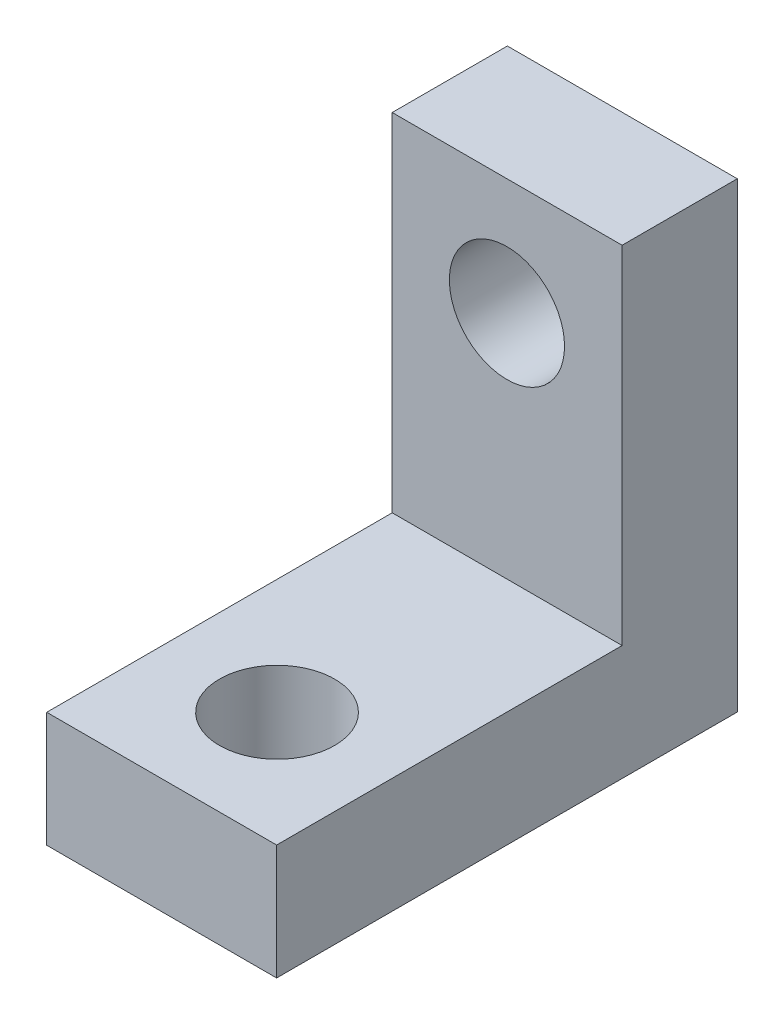
ISO-10303-21;
HEADER;
FILE_DESCRIPTION(('STEP AP214'),'2;1');
FILE_NAME('part.step','',(''),(''),'','','');
FILE_SCHEMA(('AUTOMOTIVE_DESIGN { 1 0 10303 214 1 1 1 1 }'));
ENDSEC;
DATA;
#1=APPLICATION_CONTEXT('core data for automotive mechanical design processes');
#2=APPLICATION_PROTOCOL_DEFINITION('international standard','automotive_design',2000,#1);
#3=PRODUCT_CONTEXT('',#1,'mechanical');
#4=PRODUCT('Part','Part','',(#3));
#5=PRODUCT_RELATED_PRODUCT_CATEGORY('part','',(#4));
#6=PRODUCT_DEFINITION_FORMATION('','',#4);
#7=PRODUCT_DEFINITION_CONTEXT('part definition',#1,'design');
#8=PRODUCT_DEFINITION('design','',#6,#7);
#9=PRODUCT_DEFINITION_SHAPE('','',#8);
#10=(LENGTH_UNIT() NAMED_UNIT(*) SI_UNIT(.MILLI.,.METRE.));
#11=(NAMED_UNIT(*) PLANE_ANGLE_UNIT() SI_UNIT($,.RADIAN.));
#12=(NAMED_UNIT(*) SI_UNIT($,.STERADIAN.) SOLID_ANGLE_UNIT());
#13=UNCERTAINTY_MEASURE_WITH_UNIT(LENGTH_MEASURE(1.E-05),#10,'distance_accuracy_value','');
#14=(GEOMETRIC_REPRESENTATION_CONTEXT(3) GLOBAL_UNCERTAINTY_ASSIGNED_CONTEXT((#13)) GLOBAL_UNIT_ASSIGNED_CONTEXT((#10,
#11,#12)) REPRESENTATION_CONTEXT('',''));
#15=CARTESIAN_POINT('',(0.,0.,0.));
#16=DIRECTION('',(0.,0.,1.));
#17=DIRECTION('',(1.,0.,0.));
#18=AXIS2_PLACEMENT_3D('',#15,#16,#17);
#19=CARTESIAN_POINT('',(0.,0.,6.35));
#20=DIRECTION('',(0.,0.,-1.));
#21=DIRECTION('',(-1.,0.,0.));
#22=AXIS2_PLACEMENT_3D('',#19,#20,#21);
#23=PLANE('',#22);
#24=CARTESIAN_POINT('',(0.,0.,6.35));
#25=DIRECTION('',(0.,0.,1.));
#26=DIRECTION('',(1.,0.,0.));
#27=AXIS2_PLACEMENT_3D('',#24,#25,#26);
#28=CIRCLE('',#27,3.175);
#29=CARTESIAN_POINT('',(3.175,0.,6.35));
#30=VERTEX_POINT('',#29);
#31=EDGE_CURVE('E91',#30,#30,#28,.T.);
#32=ORIENTED_EDGE('',*,*,#31,.F.);
#33=EDGE_LOOP('',(#32));
#34=FACE_BOUND('',#33,.T.);
#35=DIRECTION('',(-1.,0.,0.));
#36=VECTOR('',#35,1.);
#37=CARTESIAN_POINT('',(-6.32686783314895,-12.7,6.35));
#38=LINE('',#37,#36);
#39=CARTESIAN_POINT('',(6.35,-12.7,6.35));
#40=VERTEX_POINT('',#39);
#41=CARTESIAN_POINT('',(-6.32686783314895,-12.7,6.35));
#42=VERTEX_POINT('',#41);
#43=EDGE_CURVE('E55',#40,#42,#38,.T.);
#44=ORIENTED_EDGE('',*,*,#43,.F.);
#45=DIRECTION('',(0.,1.,0.));
#46=VECTOR('',#45,1.);
#47=CARTESIAN_POINT('',(6.35,-19.05,6.35));
#48=LINE('',#47,#46);
#49=CARTESIAN_POINT('',(6.35,6.41557466178,6.35));
#50=VERTEX_POINT('',#49);
#51=EDGE_CURVE('E110',#40,#50,#48,.T.);
#52=ORIENTED_EDGE('',*,*,#51,.T.);
#53=DIRECTION('',(-1.,0.,0.));
#54=VECTOR('',#53,1.);
#55=CARTESIAN_POINT('',(-6.32686783314895,6.41557466178,6.35));
#56=LINE('',#55,#54);
#57=CARTESIAN_POINT('',(-6.32686783314895,6.41557466178,6.35));
#58=VERTEX_POINT('',#57);
#59=EDGE_CURVE('E61',#50,#58,#56,.T.);
#60=ORIENTED_EDGE('',*,*,#59,.T.);
#61=DIRECTION('',(0.,-1.,0.));
#62=VECTOR('',#61,1.);
#63=CARTESIAN_POINT('',(-6.32686783314895,0.,6.35));
#64=LINE('',#63,#62);
#65=EDGE_CURVE('E101',#58,#42,#64,.T.);
#66=ORIENTED_EDGE('',*,*,#65,.T.);
#67=EDGE_LOOP('',(#44,#52,#60,#66));
#68=FACE_BOUND('',#67,.T.);
#69=ADVANCED_FACE('F39',(#34,#68),#23,.F.);
#70=CARTESIAN_POINT('',(0.,0.,0.));
#71=DIRECTION('',(0.,0.,-1.));
#72=DIRECTION('',(-1.,0.,0.));
#73=AXIS2_PLACEMENT_3D('',#70,#71,#72);
#74=PLANE('',#73);
#75=DIRECTION('',(0.,-1.,0.));
#76=VECTOR('',#75,1.);
#77=CARTESIAN_POINT('',(-6.32686783314895,0.,0.));
#78=LINE('',#77,#76);
#79=CARTESIAN_POINT('',(-6.32686783314895,6.41557466178,0.));
#80=VERTEX_POINT('',#79);
#81=CARTESIAN_POINT('',(-6.32686783314895,-19.05,0.));
#82=VERTEX_POINT('',#81);
#83=EDGE_CURVE('E80',#80,#82,#78,.T.);
#84=ORIENTED_EDGE('',*,*,#83,.F.);
#85=DIRECTION('',(-1.,0.,0.));
#86=VECTOR('',#85,1.);
#87=CARTESIAN_POINT('',(-6.32686783314895,6.41557466178,0.));
#88=LINE('',#87,#86);
#89=CARTESIAN_POINT('',(6.35,6.41557466178,0.));
#90=VERTEX_POINT('',#89);
#91=EDGE_CURVE('E84',#90,#80,#88,.T.);
#92=ORIENTED_EDGE('',*,*,#91,.F.);
#93=DIRECTION('',(0.,1.,0.));
#94=VECTOR('',#93,1.);
#95=CARTESIAN_POINT('',(6.35,6.41557466178,0.));
#96=LINE('',#95,#94);
#97=CARTESIAN_POINT('',(6.35,-19.05,0.));
#98=VERTEX_POINT('',#97);
#99=EDGE_CURVE('E102',#98,#90,#96,.T.);
#100=ORIENTED_EDGE('',*,*,#99,.F.);
#101=DIRECTION('',(1.,0.,0.));
#102=VECTOR('',#101,1.);
#103=CARTESIAN_POINT('',(-6.32686783314895,-19.05,0.));
#104=LINE('',#103,#102);
#105=EDGE_CURVE('E86',#82,#98,#104,.T.);
#106=ORIENTED_EDGE('',*,*,#105,.F.);
#107=EDGE_LOOP('',(#84,#92,#100,#106));
#108=FACE_BOUND('',#107,.T.);
#109=CARTESIAN_POINT('',(0.,0.,0.));
#110=DIRECTION('',(0.,0.,1.));
#111=DIRECTION('',(1.,0.,0.));
#112=AXIS2_PLACEMENT_3D('',#109,#110,#111);
#113=CIRCLE('',#112,3.175);
#114=CARTESIAN_POINT('',(3.175,0.,0.));
#115=VERTEX_POINT('',#114);
#116=EDGE_CURVE('E158',#115,#115,#113,.T.);
#117=ORIENTED_EDGE('',*,*,#116,.T.);
#118=EDGE_LOOP('',(#117));
#119=FACE_BOUND('',#118,.T.);
#120=ADVANCED_FACE('F82',(#108,#119),#74,.T.);
#121=CARTESIAN_POINT('',(-6.32686783314895,0.,6.35));
#122=DIRECTION('',(1.,0.,0.));
#123=DIRECTION('',(0.,1.,0.));
#124=AXIS2_PLACEMENT_3D('',#121,#122,#123);
#125=PLANE('',#124);
#126=ORIENTED_EDGE('',*,*,#83,.T.);
#127=DIRECTION('',(0.,0.,-1.));
#128=VECTOR('',#127,1.);
#129=CARTESIAN_POINT('',(-6.32686783314895,-19.05,6.35));
#130=LINE('',#129,#128);
#131=CARTESIAN_POINT('',(-6.32686783314895,-19.05,25.4));
#132=VERTEX_POINT('',#131);
#133=EDGE_CURVE('E11',#132,#82,#130,.T.);
#134=ORIENTED_EDGE('',*,*,#133,.F.);
#135=DIRECTION('',(0.,-1.,0.));
#136=VECTOR('',#135,1.);
#137=CARTESIAN_POINT('',(-6.32686783314895,-19.05,25.4));
#138=LINE('',#137,#136);
#139=CARTESIAN_POINT('',(-6.32686783314895,-12.7,25.4));
#140=VERTEX_POINT('',#139);
#141=EDGE_CURVE('E136',#140,#132,#138,.T.);
#142=ORIENTED_EDGE('',*,*,#141,.F.);
#143=DIRECTION('',(0.,0.,-1.));
#144=VECTOR('',#143,1.);
#145=CARTESIAN_POINT('',(-6.32686783314895,-12.7,25.4));
#146=LINE('',#145,#144);
#147=EDGE_CURVE('E148',#140,#42,#146,.T.);
#148=ORIENTED_EDGE('',*,*,#147,.T.);
#149=ORIENTED_EDGE('',*,*,#65,.F.);
#150=DIRECTION('',(0.,0.,-1.));
#151=VECTOR('',#150,1.);
#152=CARTESIAN_POINT('',(-6.32686783314895,6.41557466178,6.35));
#153=LINE('',#152,#151);
#154=EDGE_CURVE('E96',#58,#80,#153,.T.);
#155=ORIENTED_EDGE('',*,*,#154,.T.);
#156=EDGE_LOOP('',(#126,#134,#142,#148,#149,#155));
#157=FACE_BOUND('',#156,.T.);
#158=ADVANCED_FACE('F41',(#157),#125,.F.);
#159=CARTESIAN_POINT('',(-6.32686783314895,-19.05,6.35));
#160=DIRECTION('',(0.,1.,0.));
#161=DIRECTION('',(0.,0.,1.));
#162=AXIS2_PLACEMENT_3D('',#159,#160,#161);
#163=PLANE('',#162);
#164=CARTESIAN_POINT('',(0.0231321668510498,-19.05,19.05));
#165=DIRECTION('',(0.,1.,0.));
#166=DIRECTION('',(0.,0.,1.));
#167=AXIS2_PLACEMENT_3D('',#164,#165,#166);
#168=CIRCLE('',#167,3.175);
#169=CARTESIAN_POINT('',(0.0231321668510498,-19.05,22.225));
#170=VERTEX_POINT('',#169);
#171=EDGE_CURVE('E151',#170,#170,#168,.T.);
#172=ORIENTED_EDGE('',*,*,#171,.T.);
#173=EDGE_LOOP('',(#172));
#174=FACE_BOUND('',#173,.T.);
#175=ORIENTED_EDGE('',*,*,#105,.T.);
#176=DIRECTION('',(0.,0.,-1.));
#177=VECTOR('',#176,1.);
#178=CARTESIAN_POINT('',(6.35,-19.05,6.35));
#179=LINE('',#178,#177);
#180=CARTESIAN_POINT('',(6.35,-19.05,25.4));
#181=VERTEX_POINT('',#180);
#182=EDGE_CURVE('E48',#181,#98,#179,.T.);
#183=ORIENTED_EDGE('',*,*,#182,.F.);
#184=DIRECTION('',(1.,0.,0.));
#185=VECTOR('',#184,1.);
#186=CARTESIAN_POINT('',(-6.32686783314895,-19.05,25.4));
#187=LINE('',#186,#185);
#188=EDGE_CURVE('E128',#132,#181,#187,.T.);
#189=ORIENTED_EDGE('',*,*,#188,.F.);
#190=ORIENTED_EDGE('',*,*,#133,.T.);
#191=EDGE_LOOP('',(#175,#183,#189,#190));
#192=FACE_BOUND('',#191,.T.);
#193=ADVANCED_FACE('F126',(#174,#192),#163,.F.);
#194=CARTESIAN_POINT('',(6.35,6.41557466178,6.35));
#195=DIRECTION('',(-1.,0.,0.));
#196=DIRECTION('',(0.,0.,1.));
#197=AXIS2_PLACEMENT_3D('',#194,#195,#196);
#198=PLANE('',#197);
#199=ORIENTED_EDGE('',*,*,#99,.T.);
#200=DIRECTION('',(0.,0.,-1.));
#201=VECTOR('',#200,1.);
#202=CARTESIAN_POINT('',(6.35,6.41557466178,6.35));
#203=LINE('',#202,#201);
#204=EDGE_CURVE('E99',#50,#90,#203,.T.);
#205=ORIENTED_EDGE('',*,*,#204,.F.);
#206=ORIENTED_EDGE('',*,*,#51,.F.);
#207=DIRECTION('',(0.,0.,-1.));
#208=VECTOR('',#207,1.);
#209=CARTESIAN_POINT('',(6.35,-12.7,25.4));
#210=LINE('',#209,#208);
#211=CARTESIAN_POINT('',(6.35,-12.7,25.4));
#212=VERTEX_POINT('',#211);
#213=EDGE_CURVE('E154',#212,#40,#210,.T.);
#214=ORIENTED_EDGE('',*,*,#213,.F.);
#215=DIRECTION('',(0.,1.,0.));
#216=VECTOR('',#215,1.);
#217=CARTESIAN_POINT('',(6.35,-19.05,25.4));
#218=LINE('',#217,#216);
#219=EDGE_CURVE('E122',#181,#212,#218,.T.);
#220=ORIENTED_EDGE('',*,*,#219,.F.);
#221=ORIENTED_EDGE('',*,*,#182,.T.);
#222=EDGE_LOOP('',(#199,#205,#206,#214,#220,#221));
#223=FACE_BOUND('',#222,.T.);
#224=ADVANCED_FACE('F118',(#223),#198,.F.);
#225=CARTESIAN_POINT('',(-6.32686783314895,6.41557466178,6.35));
#226=DIRECTION('',(0.,-1.,0.));
#227=DIRECTION('',(0.,0.,-1.));
#228=AXIS2_PLACEMENT_3D('',#225,#226,#227);
#229=PLANE('',#228);
#230=ORIENTED_EDGE('',*,*,#91,.T.);
#231=ORIENTED_EDGE('',*,*,#154,.F.);
#232=ORIENTED_EDGE('',*,*,#59,.F.);
#233=ORIENTED_EDGE('',*,*,#204,.T.);
#234=EDGE_LOOP('',(#230,#231,#232,#233));
#235=FACE_BOUND('',#234,.T.);
#236=ADVANCED_FACE('F95',(#235),#229,.F.);
#237=CARTESIAN_POINT('',(0.,0.,6.35));
#238=DIRECTION('',(0.,0.,-1.));
#239=DIRECTION('',(-1.,0.,0.));
#240=AXIS2_PLACEMENT_3D('',#237,#238,#239);
#241=CYLINDRICAL_SURFACE('',#240,3.175);
#242=ORIENTED_EDGE('',*,*,#31,.T.);
#243=EDGE_LOOP('',(#242));
#244=FACE_BOUND('',#243,.T.);
#245=ORIENTED_EDGE('',*,*,#116,.F.);
#246=EDGE_LOOP('',(#245));
#247=FACE_BOUND('',#246,.T.);
#248=ADVANCED_FACE('F180',(#244,#247),#241,.F.);
#249=CARTESIAN_POINT('',(-6.32686783314895,-12.7,25.4));
#250=DIRECTION('',(0.,-1.,0.));
#251=DIRECTION('',(0.,0.,-1.));
#252=AXIS2_PLACEMENT_3D('',#249,#250,#251);
#253=PLANE('',#252);
#254=CARTESIAN_POINT('',(0.0231321668510498,-12.7,19.05));
#255=DIRECTION('',(0.,1.,0.));
#256=DIRECTION('',(0.,0.,1.));
#257=AXIS2_PLACEMENT_3D('',#254,#255,#256);
#258=CIRCLE('',#257,3.175);
#259=CARTESIAN_POINT('',(0.0231321668510498,-12.7,22.225));
#260=VERTEX_POINT('',#259);
#261=EDGE_CURVE('E213',#260,#260,#258,.T.);
#262=ORIENTED_EDGE('',*,*,#261,.F.);
#263=EDGE_LOOP('',(#262));
#264=FACE_BOUND('',#263,.T.);
#265=ORIENTED_EDGE('',*,*,#43,.T.);
#266=ORIENTED_EDGE('',*,*,#147,.F.);
#267=DIRECTION('',(-1.,0.,0.));
#268=VECTOR('',#267,1.);
#269=CARTESIAN_POINT('',(-6.32686783314895,-12.7,25.4));
#270=LINE('',#269,#268);
#271=EDGE_CURVE('E141',#212,#140,#270,.T.);
#272=ORIENTED_EDGE('',*,*,#271,.F.);
#273=ORIENTED_EDGE('',*,*,#213,.T.);
#274=EDGE_LOOP('',(#265,#266,#272,#273));
#275=FACE_BOUND('',#274,.T.);
#276=ADVANCED_FACE('F173',(#264,#275),#253,.F.);
#277=CARTESIAN_POINT('',(0.,0.,25.4));
#278=DIRECTION('',(0.,0.,-1.));
#279=DIRECTION('',(-1.,0.,0.));
#280=AXIS2_PLACEMENT_3D('',#277,#278,#279);
#281=PLANE('',#280);
#282=ORIENTED_EDGE('',*,*,#141,.T.);
#283=ORIENTED_EDGE('',*,*,#188,.T.);
#284=ORIENTED_EDGE('',*,*,#219,.T.);
#285=ORIENTED_EDGE('',*,*,#271,.T.);
#286=EDGE_LOOP('',(#282,#283,#284,#285));
#287=FACE_BOUND('',#286,.T.);
#288=ADVANCED_FACE('F133',(#287),#281,.F.);
#289=CARTESIAN_POINT('',(0.0231321668510498,-31.75,19.05));
#290=DIRECTION('',(0.,1.,0.));
#291=DIRECTION('',(0.,0.,1.));
#292=AXIS2_PLACEMENT_3D('',#289,#290,#291);
#293=CYLINDRICAL_SURFACE('',#292,3.175);
#294=CARTESIAN_POINT('',(0.0231321668510498,-12.7,22.225));
#295=CARTESIAN_POINT('',(0.0231321668510498,-12.7661458333333,22.225));
#296=CARTESIAN_POINT('',(0.0231321668510498,-12.8322916666667,22.225));
#297=CARTESIAN_POINT('',(0.0231321668510498,-12.9645833333333,22.225));
#298=CARTESIAN_POINT('',(0.0231321668510498,-13.0307291666667,22.225));
#299=CARTESIAN_POINT('',(0.0231321668510498,-13.1630208333333,22.225));
#300=CARTESIAN_POINT('',(0.0231321668510498,-13.2291666666667,22.225));
#301=CARTESIAN_POINT('',(0.0231321668510498,-13.3614583333333,22.225));
#302=CARTESIAN_POINT('',(0.0231321668510498,-13.4276041666667,22.225));
#303=CARTESIAN_POINT('',(0.0231321668510498,-13.5598958333333,22.225));
#304=CARTESIAN_POINT('',(0.0231321668510498,-13.6260416666667,22.225));
#305=CARTESIAN_POINT('',(0.0231321668510498,-13.7583333333333,22.225));
#306=CARTESIAN_POINT('',(0.0231321668510498,-13.8244791666667,22.225));
#307=CARTESIAN_POINT('',(0.0231321668510498,-13.9567708333333,22.225));
#308=CARTESIAN_POINT('',(0.0231321668510498,-14.0229166666667,22.225));
#309=CARTESIAN_POINT('',(0.0231321668510498,-14.1552083333333,22.225));
#310=CARTESIAN_POINT('',(0.0231321668510498,-14.2213541666667,22.225));
#311=CARTESIAN_POINT('',(0.0231321668510498,-14.3536458333333,22.225));
#312=CARTESIAN_POINT('',(0.0231321668510498,-14.4197916666667,22.225));
#313=CARTESIAN_POINT('',(0.0231321668510498,-14.5520833333333,22.225));
#314=CARTESIAN_POINT('',(0.0231321668510498,-14.6182291666667,22.225));
#315=CARTESIAN_POINT('',(0.0231321668510498,-14.7505208333333,22.225));
#316=CARTESIAN_POINT('',(0.0231321668510498,-14.8166666666667,22.225));
#317=CARTESIAN_POINT('',(0.0231321668510498,-14.9489583333333,22.225));
#318=CARTESIAN_POINT('',(0.0231321668510498,-15.0151041666667,22.225));
#319=CARTESIAN_POINT('',(0.0231321668510498,-15.1473958333333,22.225));
#320=CARTESIAN_POINT('',(0.0231321668510498,-15.2135416666667,22.225));
#321=CARTESIAN_POINT('',(0.0231321668510498,-15.3458333333333,22.225));
#322=CARTESIAN_POINT('',(0.0231321668510498,-15.4119791666667,22.225));
#323=CARTESIAN_POINT('',(0.0231321668510498,-15.5442708333333,22.225));
#324=CARTESIAN_POINT('',(0.0231321668510498,-15.6104166666667,22.225));
#325=CARTESIAN_POINT('',(0.0231321668510498,-15.7427083333333,22.225));
#326=CARTESIAN_POINT('',(0.0231321668510498,-15.8088541666667,22.225));
#327=CARTESIAN_POINT('',(0.0231321668510498,-15.9411458333333,22.225));
#328=CARTESIAN_POINT('',(0.0231321668510498,-16.0072916666667,22.225));
#329=CARTESIAN_POINT('',(0.0231321668510498,-16.1395833333333,22.225));
#330=CARTESIAN_POINT('',(0.0231321668510498,-16.2057291666667,22.225));
#331=CARTESIAN_POINT('',(0.0231321668510498,-16.3380208333333,22.225));
#332=CARTESIAN_POINT('',(0.0231321668510498,-16.4041666666667,22.225));
#333=CARTESIAN_POINT('',(0.0231321668510498,-16.5364583333333,22.225));
#334=CARTESIAN_POINT('',(0.0231321668510498,-16.6026041666667,22.225));
#335=CARTESIAN_POINT('',(0.0231321668510498,-16.7348958333333,22.225));
#336=CARTESIAN_POINT('',(0.0231321668510498,-16.8010416666667,22.225));
#337=CARTESIAN_POINT('',(0.0231321668510498,-16.9333333333333,22.225));
#338=CARTESIAN_POINT('',(0.0231321668510498,-16.9994791666667,22.225));
#339=CARTESIAN_POINT('',(0.0231321668510498,-17.1317708333333,22.225));
#340=CARTESIAN_POINT('',(0.0231321668510498,-17.1979166666667,22.225));
#341=CARTESIAN_POINT('',(0.0231321668510498,-17.3302083333333,22.225));
#342=CARTESIAN_POINT('',(0.0231321668510498,-17.3963541666667,22.225));
#343=CARTESIAN_POINT('',(0.0231321668510498,-17.5286458333333,22.225));
#344=CARTESIAN_POINT('',(0.0231321668510498,-17.5947916666667,22.225));
#345=CARTESIAN_POINT('',(0.0231321668510498,-17.7270833333333,22.225));
#346=CARTESIAN_POINT('',(0.0231321668510498,-17.7932291666667,22.225));
#347=CARTESIAN_POINT('',(0.0231321668510498,-17.9255208333333,22.225));
#348=CARTESIAN_POINT('',(0.0231321668510498,-17.9916666666667,22.225));
#349=CARTESIAN_POINT('',(0.0231321668510498,-18.1239583333333,22.225));
#350=CARTESIAN_POINT('',(0.0231321668510498,-18.1901041666667,22.225));
#351=CARTESIAN_POINT('',(0.0231321668510498,-18.3223958333333,22.225));
#352=CARTESIAN_POINT('',(0.0231321668510498,-18.3885416666667,22.225));
#353=CARTESIAN_POINT('',(0.0231321668510498,-18.5208333333333,22.225));
#354=CARTESIAN_POINT('',(0.0231321668510498,-18.5869791666667,22.225));
#355=CARTESIAN_POINT('',(0.0231321668510498,-18.7192708333333,22.225));
#356=CARTESIAN_POINT('',(0.0231321668510498,-18.7854166666667,22.225));
#357=CARTESIAN_POINT('',(0.0231321668510498,-18.9177083333333,22.225));
#358=CARTESIAN_POINT('',(0.0231321668510498,-18.9838541666667,22.225));
#359=CARTESIAN_POINT('',(0.0231321668510498,-19.05,22.225));
#360=B_SPLINE_CURVE_WITH_KNOTS('',3,(#294,#295,#296,#297,#298,#299,#300,#301,#302,#303,#304,
#305,#306,#307,#308,#309,#310,#311,#312,#313,#314,#315,#316,#317,#318,#319,#320,#321,#322,#323,
#324,#325,#326,#327,#328,#329,#330,#331,#332,#333,#334,#335,#336,#337,#338,#339,#340,#341,#342,
#343,#344,#345,#346,#347,#348,#349,#350,#351,#352,#353,#354,#355,#356,#357,#358,#359),
.UNSPECIFIED.,.F.,.F.,(4,2,2,2,2,2,2,2,2,2,2,2,2,2,2,2,2,2,2,2,2,2,2,2,2,2,2,2,2,2,2,2,4),(0.,
0.198437499999999,0.396875000000001,0.5953125,0.793749999999999,0.992187500000002,1.190625,
1.3890625,1.5875,1.7859375,1.984375,2.1828125,2.38125,2.5796875,2.778125,2.9765625,3.175,
3.3734375,3.571875,3.7703125,3.96875,4.1671875,4.365625,4.5640625,4.7625,4.9609375,5.159375,
5.3578125,5.55625,5.7546875,5.953125,6.1515625,6.35),.UNSPECIFIED.);
#361=EDGE_CURVE('BSEAM187',#260,#170,#360,.T.);
#362=ORIENTED_EDGE('',*,*,#261,.T.);
#363=ORIENTED_EDGE('',*,*,#171,.F.);
#364=ORIENTED_EDGE('',*,*,#361,.T.);
#365=ORIENTED_EDGE('',*,*,#361,.F.);
#366=EDGE_LOOP('',(#362,#364,#363,#365));
#367=FACE_BOUND('',#366,.T.);
#368=ADVANCED_FACE('F187',(#367),#293,.F.);
#369=CLOSED_SHELL('',(#69,#120,#158,#193,#224,#236,#248,#276,#288,#368));
#370=MANIFOLD_SOLID_BREP('B2',#369);
#371=ADVANCED_BREP_SHAPE_REPRESENTATION('',(#18,#370),#14);
#372=SHAPE_DEFINITION_REPRESENTATION(#9,#371);
ENDSEC;
END-ISO-10303-21;
